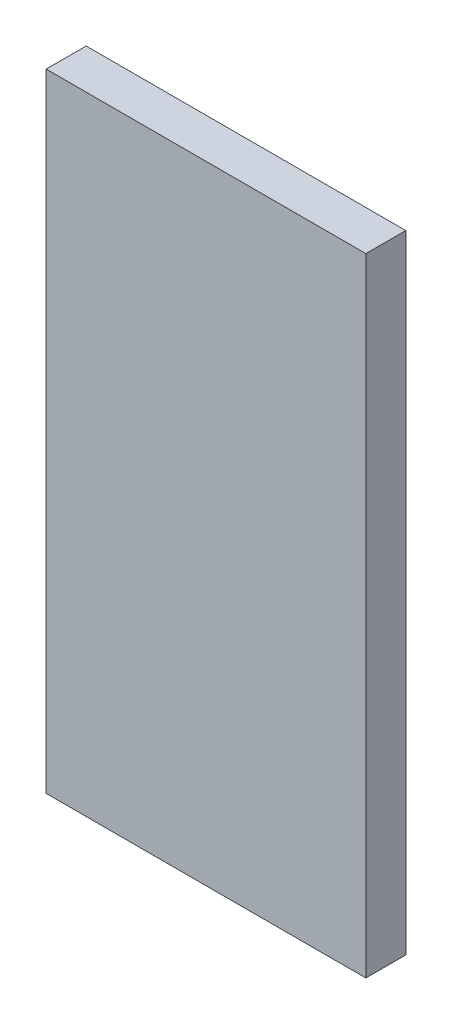
ISO-10303-21;
HEADER;
FILE_DESCRIPTION(('STEP AP214'),'2;1');
FILE_NAME('part.step','',(''),(''),'','','');
FILE_SCHEMA(('AUTOMOTIVE_DESIGN { 1 0 10303 214 1 1 1 1 }'));
ENDSEC;
DATA;
#1=APPLICATION_CONTEXT('core data for automotive mechanical design processes');
#2=APPLICATION_PROTOCOL_DEFINITION('international standard','automotive_design',2000,#1);
#3=PRODUCT_CONTEXT('',#1,'mechanical');
#4=PRODUCT('Part','Part','',(#3));
#5=PRODUCT_RELATED_PRODUCT_CATEGORY('part','',(#4));
#6=PRODUCT_DEFINITION_FORMATION('','',#4);
#7=PRODUCT_DEFINITION_CONTEXT('part definition',#1,'design');
#8=PRODUCT_DEFINITION('design','',#6,#7);
#9=PRODUCT_DEFINITION_SHAPE('','',#8);
#10=(LENGTH_UNIT() NAMED_UNIT(*) SI_UNIT(.MILLI.,.METRE.));
#11=(NAMED_UNIT(*) PLANE_ANGLE_UNIT() SI_UNIT($,.RADIAN.));
#12=(NAMED_UNIT(*) SI_UNIT($,.STERADIAN.) SOLID_ANGLE_UNIT());
#13=UNCERTAINTY_MEASURE_WITH_UNIT(LENGTH_MEASURE(1.E-05),#10,'distance_accuracy_value','');
#14=(GEOMETRIC_REPRESENTATION_CONTEXT(3) GLOBAL_UNCERTAINTY_ASSIGNED_CONTEXT((#13)) GLOBAL_UNIT_ASSIGNED_CONTEXT((#10,
#11,#12)) REPRESENTATION_CONTEXT('',''));
#15=CARTESIAN_POINT('',(0.,0.,0.));
#16=DIRECTION('',(0.,0.,1.));
#17=DIRECTION('',(1.,0.,0.));
#18=AXIS2_PLACEMENT_3D('',#15,#16,#17);
#19=CARTESIAN_POINT('',(25.4,-49.85004,6.35));
#20=DIRECTION('',(-1.,0.,0.));
#21=DIRECTION('',(0.,0.,1.));
#22=AXIS2_PLACEMENT_3D('',#19,#20,#21);
#23=PLANE('',#22);
#24=DIRECTION('',(0.,1.,0.));
#25=VECTOR('',#24,1.);
#26=CARTESIAN_POINT('',(25.4,-49.85004,0.));
#27=LINE('',#26,#25);
#28=CARTESIAN_POINT('',(25.4,-49.85004,0.));
#29=VERTEX_POINT('',#28);
#30=CARTESIAN_POINT('',(25.4,49.85004,0.));
#31=VERTEX_POINT('',#30);
#32=EDGE_CURVE('E104',#29,#31,#27,.T.);
#33=ORIENTED_EDGE('',*,*,#32,.T.);
#34=DIRECTION('',(0.,0.,-1.));
#35=VECTOR('',#34,1.);
#36=CARTESIAN_POINT('',(25.4,49.85004,6.35));
#37=LINE('',#36,#35);
#38=CARTESIAN_POINT('',(25.4,49.85004,6.35));
#39=VERTEX_POINT('',#38);
#40=EDGE_CURVE('E11',#39,#31,#37,.T.);
#41=ORIENTED_EDGE('',*,*,#40,.F.);
#42=DIRECTION('',(0.,1.,0.));
#43=VECTOR('',#42,1.);
#44=CARTESIAN_POINT('',(25.4,-49.85004,6.35));
#45=LINE('',#44,#43);
#46=CARTESIAN_POINT('',(25.4,-49.85004,6.35));
#47=VERTEX_POINT('',#46);
#48=EDGE_CURVE('E92',#47,#39,#45,.T.);
#49=ORIENTED_EDGE('',*,*,#48,.F.);
#50=DIRECTION('',(0.,0.,-1.));
#51=VECTOR('',#50,1.);
#52=CARTESIAN_POINT('',(25.4,-49.85004,6.35));
#53=LINE('',#52,#51);
#54=EDGE_CURVE('E100',#47,#29,#53,.T.);
#55=ORIENTED_EDGE('',*,*,#54,.T.);
#56=EDGE_LOOP('',(#33,#41,#49,#55));
#57=FACE_BOUND('',#56,.T.);
#58=ADVANCED_FACE('F41',(#57),#23,.F.);
#59=CARTESIAN_POINT('',(-25.4,49.85004,6.35));
#60=DIRECTION('',(0.,-1.,0.));
#61=DIRECTION('',(0.,0.,-1.));
#62=AXIS2_PLACEMENT_3D('',#59,#60,#61);
#63=PLANE('',#62);
#64=DIRECTION('',(-1.,0.,0.));
#65=VECTOR('',#64,1.);
#66=CARTESIAN_POINT('',(-25.4,49.85004,0.));
#67=LINE('',#66,#65);
#68=CARTESIAN_POINT('',(-25.4,49.85004,0.));
#69=VERTEX_POINT('',#68);
#70=EDGE_CURVE('E96',#31,#69,#67,.T.);
#71=ORIENTED_EDGE('',*,*,#70,.T.);
#72=DIRECTION('',(0.,0.,-1.));
#73=VECTOR('',#72,1.);
#74=CARTESIAN_POINT('',(-25.4,49.85004,6.35));
#75=LINE('',#74,#73);
#76=CARTESIAN_POINT('',(-25.4,49.85004,6.35));
#77=VERTEX_POINT('',#76);
#78=EDGE_CURVE('E49',#77,#69,#75,.T.);
#79=ORIENTED_EDGE('',*,*,#78,.F.);
#80=DIRECTION('',(-1.,0.,0.));
#81=VECTOR('',#80,1.);
#82=CARTESIAN_POINT('',(-25.4,49.85004,6.35));
#83=LINE('',#82,#81);
#84=EDGE_CURVE('E87',#39,#77,#83,.T.);
#85=ORIENTED_EDGE('',*,*,#84,.F.);
#86=ORIENTED_EDGE('',*,*,#40,.T.);
#87=EDGE_LOOP('',(#71,#79,#85,#86));
#88=FACE_BOUND('',#87,.T.);
#89=ADVANCED_FACE('F95',(#88),#63,.F.);
#90=CARTESIAN_POINT('',(-25.4,-49.85004,6.35));
#91=DIRECTION('',(1.,0.,0.));
#92=DIRECTION('',(0.,0.,-1.));
#93=AXIS2_PLACEMENT_3D('',#90,#91,#92);
#94=PLANE('',#93);
#95=DIRECTION('',(0.,-1.,0.));
#96=VECTOR('',#95,1.);
#97=CARTESIAN_POINT('',(-25.4,-49.85004,0.));
#98=LINE('',#97,#96);
#99=CARTESIAN_POINT('',(-25.4,-49.85004,0.));
#100=VERTEX_POINT('',#99);
#101=EDGE_CURVE('E74',#69,#100,#98,.T.);
#102=ORIENTED_EDGE('',*,*,#101,.T.);
#103=DIRECTION('',(0.,0.,-1.));
#104=VECTOR('',#103,1.);
#105=CARTESIAN_POINT('',(-25.4,-49.85004,6.35));
#106=LINE('',#105,#104);
#107=CARTESIAN_POINT('',(-25.4,-49.85004,6.35));
#108=VERTEX_POINT('',#107);
#109=EDGE_CURVE('E97',#108,#100,#106,.T.);
#110=ORIENTED_EDGE('',*,*,#109,.F.);
#111=DIRECTION('',(0.,-1.,0.));
#112=VECTOR('',#111,1.);
#113=CARTESIAN_POINT('',(-25.4,-49.85004,6.35));
#114=LINE('',#113,#112);
#115=EDGE_CURVE('E90',#77,#108,#114,.T.);
#116=ORIENTED_EDGE('',*,*,#115,.F.);
#117=ORIENTED_EDGE('',*,*,#78,.T.);
#118=EDGE_LOOP('',(#102,#110,#116,#117));
#119=FACE_BOUND('',#118,.T.);
#120=ADVANCED_FACE('F98',(#119),#94,.F.);
#121=CARTESIAN_POINT('',(-25.4,-49.85004,6.35));
#122=DIRECTION('',(0.,1.,0.));
#123=DIRECTION('',(0.,0.,1.));
#124=AXIS2_PLACEMENT_3D('',#121,#122,#123);
#125=PLANE('',#124);
#126=DIRECTION('',(1.,0.,0.));
#127=VECTOR('',#126,1.);
#128=CARTESIAN_POINT('',(-25.4,-49.85004,0.));
#129=LINE('',#128,#127);
#130=EDGE_CURVE('E80',#100,#29,#129,.T.);
#131=ORIENTED_EDGE('',*,*,#130,.T.);
#132=ORIENTED_EDGE('',*,*,#54,.F.);
#133=DIRECTION('',(1.,0.,0.));
#134=VECTOR('',#133,1.);
#135=CARTESIAN_POINT('',(-25.4,-49.85004,6.35));
#136=LINE('',#135,#134);
#137=EDGE_CURVE('E57',#108,#47,#136,.T.);
#138=ORIENTED_EDGE('',*,*,#137,.F.);
#139=ORIENTED_EDGE('',*,*,#109,.T.);
#140=EDGE_LOOP('',(#131,#132,#138,#139));
#141=FACE_BOUND('',#140,.T.);
#142=ADVANCED_FACE('F111',(#141),#125,.F.);
#143=CARTESIAN_POINT('',(0.,0.,6.35));
#144=DIRECTION('',(0.,0.,-1.));
#145=DIRECTION('',(-1.,0.,0.));
#146=AXIS2_PLACEMENT_3D('',#143,#144,#145);
#147=PLANE('',#146);
#148=ORIENTED_EDGE('',*,*,#48,.T.);
#149=ORIENTED_EDGE('',*,*,#84,.T.);
#150=ORIENTED_EDGE('',*,*,#115,.T.);
#151=ORIENTED_EDGE('',*,*,#137,.T.);
#152=EDGE_LOOP('',(#148,#149,#150,#151));
#153=FACE_BOUND('',#152,.T.);
#154=ADVANCED_FACE('F88',(#153),#147,.F.);
#155=CARTESIAN_POINT('',(0.,0.,0.));
#156=DIRECTION('',(0.,0.,-1.));
#157=DIRECTION('',(-1.,0.,0.));
#158=AXIS2_PLACEMENT_3D('',#155,#156,#157);
#159=PLANE('',#158);
#160=ORIENTED_EDGE('',*,*,#32,.F.);
#161=ORIENTED_EDGE('',*,*,#130,.F.);
#162=ORIENTED_EDGE('',*,*,#101,.F.);
#163=ORIENTED_EDGE('',*,*,#70,.F.);
#164=EDGE_LOOP('',(#160,#161,#162,#163));
#165=FACE_BOUND('',#164,.T.);
#166=ADVANCED_FACE('F114',(#165),#159,.T.);
#167=CLOSED_SHELL('',(#58,#89,#120,#142,#154,#166));
#168=MANIFOLD_SOLID_BREP('B2',#167);
#169=ADVANCED_BREP_SHAPE_REPRESENTATION('',(#18,#168),#14);
#170=SHAPE_DEFINITION_REPRESENTATION(#9,#169);
ENDSEC;
END-ISO-10303-21;
